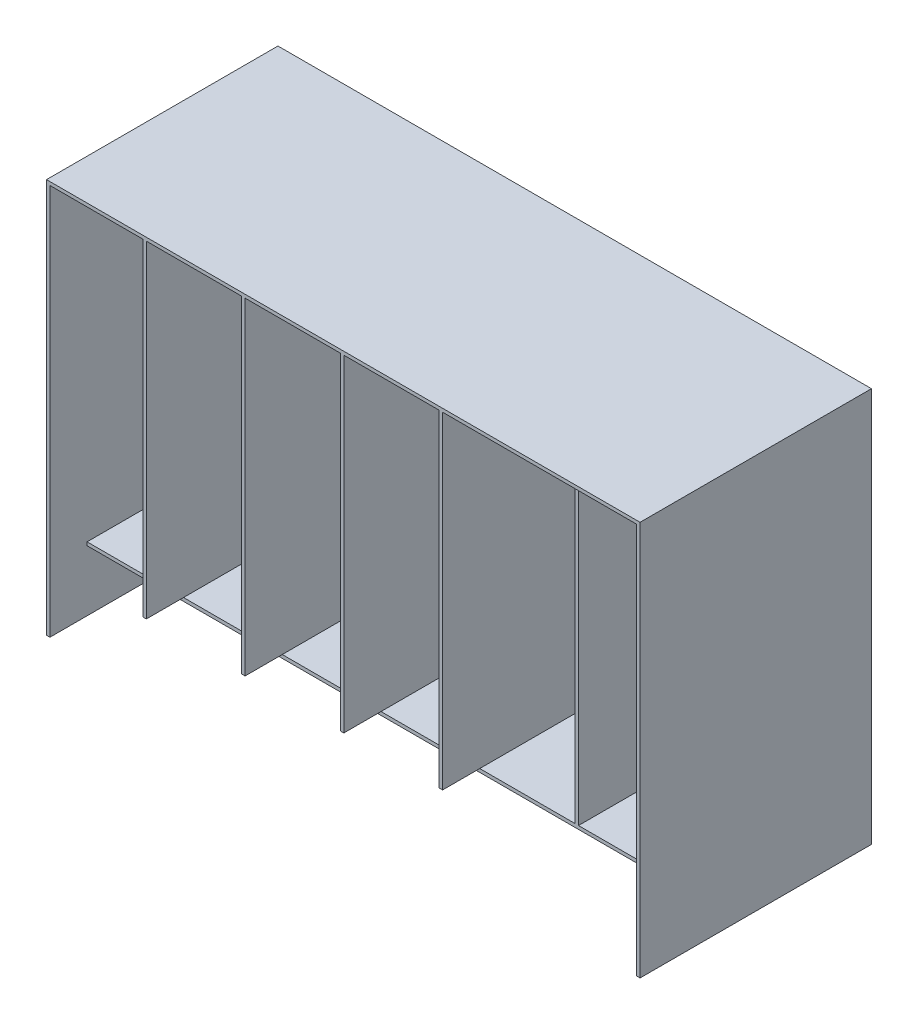
ISO-10303-21;
HEADER;
FILE_DESCRIPTION(('STEP AP214'),'2;1');
FILE_NAME('part.step','',(''),(''),'','','');
FILE_SCHEMA(('AUTOMOTIVE_DESIGN { 1 0 10303 214 1 1 1 1 }'));
ENDSEC;
DATA;
#1=APPLICATION_CONTEXT('core data for automotive mechanical design processes');
#2=APPLICATION_PROTOCOL_DEFINITION('international standard','automotive_design',2000,#1);
#3=PRODUCT_CONTEXT('',#1,'mechanical');
#4=PRODUCT('Part','Part','',(#3));
#5=PRODUCT_RELATED_PRODUCT_CATEGORY('part','',(#4));
#6=PRODUCT_DEFINITION_FORMATION('','',#4);
#7=PRODUCT_DEFINITION_CONTEXT('part definition',#1,'design');
#8=PRODUCT_DEFINITION('design','',#6,#7);
#9=PRODUCT_DEFINITION_SHAPE('','',#8);
#10=(LENGTH_UNIT() NAMED_UNIT(*) SI_UNIT(.MILLI.,.METRE.));
#11=(NAMED_UNIT(*) PLANE_ANGLE_UNIT() SI_UNIT($,.RADIAN.));
#12=(NAMED_UNIT(*) SI_UNIT($,.STERADIAN.) SOLID_ANGLE_UNIT());
#13=UNCERTAINTY_MEASURE_WITH_UNIT(LENGTH_MEASURE(1.E-05),#10,'distance_accuracy_value','');
#14=(GEOMETRIC_REPRESENTATION_CONTEXT(3) GLOBAL_UNCERTAINTY_ASSIGNED_CONTEXT((#13)) GLOBAL_UNIT_ASSIGNED_CONTEXT((#10,
#11,#12)) REPRESENTATION_CONTEXT('',''));
#15=CARTESIAN_POINT('',(0.,0.,0.));
#16=DIRECTION('',(0.,0.,1.));
#17=DIRECTION('',(1.,0.,0.));
#18=AXIS2_PLACEMENT_3D('',#15,#16,#17);
#19=CARTESIAN_POINT('',(0.,-157.216,179.775));
#20=DIRECTION('',(0.,1.,0.));
#21=DIRECTION('',(0.,0.,1.));
#22=AXIS2_PLACEMENT_3D('',#19,#20,#21);
#23=PLANE('',#22);
#24=DIRECTION('',(1.,0.,0.));
#25=VECTOR('',#24,1.);
#26=CARTESIAN_POINT('',(0.,-157.216,182.875));
#27=LINE('',#26,#25);
#28=CARTESIAN_POINT('',(-276.2265,-157.216,182.875));
#29=VERTEX_POINT('',#28);
#30=CARTESIAN_POINT('',(276.2265,-157.216,182.875));
#31=VERTEX_POINT('',#30);
#32=EDGE_CURVE('E280',#29,#31,#27,.T.);
#33=ORIENTED_EDGE('',*,*,#32,.F.);
#34=DIRECTION('',(0.,0.,-1.));
#35=VECTOR('',#34,1.);
#36=CARTESIAN_POINT('',(-276.2265,-157.216,179.775));
#37=LINE('',#36,#35);
#38=CARTESIAN_POINT('',(-276.2265,-157.216,3.175));
#39=VERTEX_POINT('',#38);
#40=EDGE_CURVE('E303',#29,#39,#37,.T.);
#41=ORIENTED_EDGE('',*,*,#40,.T.);
#42=DIRECTION('',(1.,0.,0.));
#43=VECTOR('',#42,1.);
#44=CARTESIAN_POINT('',(0.,-157.216,3.175));
#45=LINE('',#44,#43);
#46=CARTESIAN_POINT('',(276.2265,-157.216,3.175));
#47=VERTEX_POINT('',#46);
#48=EDGE_CURVE('E470',#39,#47,#45,.T.);
#49=ORIENTED_EDGE('',*,*,#48,.T.);
#50=DIRECTION('',(0.,0.,-1.));
#51=VECTOR('',#50,1.);
#52=CARTESIAN_POINT('',(276.2265,-157.216,179.775));
#53=LINE('',#52,#51);
#54=EDGE_CURVE('E309',#31,#47,#53,.T.);
#55=ORIENTED_EDGE('',*,*,#54,.F.);
#56=EDGE_LOOP('',(#33,#41,#49,#55));
#57=FACE_BOUND('',#56,.T.);
#58=ADVANCED_FACE('F41',(#57),#23,.F.);
#59=CARTESIAN_POINT('',(0.,0.,217.875));
#60=DIRECTION('',(0.,0.,1.));
#61=DIRECTION('',(1.,0.,0.));
#62=AXIS2_PLACEMENT_3D('',#59,#60,#61);
#63=PLANE('',#62);
#64=DIRECTION('',(0.,-1.,0.));
#65=VECTOR('',#64,1.);
#66=CARTESIAN_POINT('',(276.2265,0.,217.875));
#67=LINE('',#66,#65);
#68=CARTESIAN_POINT('',(276.2265,154.041,217.875));
#69=VERTEX_POINT('',#68);
#70=CARTESIAN_POINT('',(276.2265,-214.366,217.875));
#71=VERTEX_POINT('',#70);
#72=EDGE_CURVE('E554',#69,#71,#67,.T.);
#73=ORIENTED_EDGE('',*,*,#72,.T.);
#74=DIRECTION('',(1.,0.,0.));
#75=VECTOR('',#74,1.);
#76=CARTESIAN_POINT('',(0.,-214.366,217.875));
#77=LINE('',#76,#75);
#78=CARTESIAN_POINT('',(279.4015,-214.366,217.875));
#79=VERTEX_POINT('',#78);
#80=EDGE_CURVE('E408',#71,#79,#77,.T.);
#81=ORIENTED_EDGE('',*,*,#80,.T.);
#82=DIRECTION('',(0.,1.,0.));
#83=VECTOR('',#82,1.);
#84=CARTESIAN_POINT('',(279.4015,0.,217.875));
#85=LINE('',#84,#83);
#86=CARTESIAN_POINT('',(279.4015,157.216,217.875));
#87=VERTEX_POINT('',#86);
#88=EDGE_CURVE('E388',#79,#87,#85,.T.);
#89=ORIENTED_EDGE('',*,*,#88,.T.);
#90=DIRECTION('',(-1.,0.,0.));
#91=VECTOR('',#90,1.);
#92=CARTESIAN_POINT('',(0.,157.216,217.875));
#93=LINE('',#92,#91);
#94=CARTESIAN_POINT('',(-279.4015,157.216,217.875));
#95=VERTEX_POINT('',#94);
#96=EDGE_CURVE('E403',#87,#95,#93,.T.);
#97=ORIENTED_EDGE('',*,*,#96,.T.);
#98=DIRECTION('',(0.,-1.,0.));
#99=VECTOR('',#98,1.);
#100=CARTESIAN_POINT('',(-279.4015,0.,217.875));
#101=LINE('',#100,#99);
#102=CARTESIAN_POINT('',(-279.4015,-214.366,217.875));
#103=VERTEX_POINT('',#102);
#104=EDGE_CURVE('E557',#95,#103,#101,.T.);
#105=ORIENTED_EDGE('',*,*,#104,.T.);
#106=DIRECTION('',(1.,0.,0.));
#107=VECTOR('',#106,1.);
#108=CARTESIAN_POINT('',(0.,-214.366,217.875));
#109=LINE('',#108,#107);
#110=CARTESIAN_POINT('',(-276.2265,-214.366,217.875));
#111=VERTEX_POINT('',#110);
#112=EDGE_CURVE('E412',#103,#111,#109,.T.);
#113=ORIENTED_EDGE('',*,*,#112,.T.);
#114=DIRECTION('',(0.,1.,0.));
#115=VECTOR('',#114,1.);
#116=CARTESIAN_POINT('',(-276.2265,0.,217.875));
#117=LINE('',#116,#115);
#118=CARTESIAN_POINT('',(-276.2265,154.041,217.875));
#119=VERTEX_POINT('',#118);
#120=EDGE_CURVE('E556',#111,#119,#117,.T.);
#121=ORIENTED_EDGE('',*,*,#120,.T.);
#122=DIRECTION('',(1.,0.,0.));
#123=VECTOR('',#122,1.);
#124=CARTESIAN_POINT('',(0.,154.041,217.875));
#125=LINE('',#124,#123);
#126=CARTESIAN_POINT('',(-188.5945,154.041,217.875));
#127=VERTEX_POINT('',#126);
#128=EDGE_CURVE('E534',#119,#127,#125,.T.);
#129=ORIENTED_EDGE('',*,*,#128,.T.);
#130=DIRECTION('',(0.,-1.,0.));
#131=VECTOR('',#130,1.);
#132=CARTESIAN_POINT('',(-188.5945,0.,217.875));
#133=LINE('',#132,#131);
#134=CARTESIAN_POINT('',(-188.5945,-154.041,217.875));
#135=VERTEX_POINT('',#134);
#136=EDGE_CURVE('E529',#127,#135,#133,.T.);
#137=ORIENTED_EDGE('',*,*,#136,.T.);
#138=DIRECTION('',(-1.,0.,0.));
#139=VECTOR('',#138,1.);
#140=CARTESIAN_POINT('',(0.,-154.041,217.875));
#141=LINE('',#140,#139);
#142=CARTESIAN_POINT('',(-185.4195,-154.041,217.875));
#143=VERTEX_POINT('',#142);
#144=EDGE_CURVE('E587',#143,#135,#141,.T.);
#145=ORIENTED_EDGE('',*,*,#144,.F.);
#146=DIRECTION('',(0.,1.,0.));
#147=VECTOR('',#146,1.);
#148=CARTESIAN_POINT('',(-185.4195,0.,217.875));
#149=LINE('',#148,#147);
#150=CARTESIAN_POINT('',(-185.4195,154.041,217.875));
#151=VERTEX_POINT('',#150);
#152=EDGE_CURVE('E546',#143,#151,#149,.T.);
#153=ORIENTED_EDGE('',*,*,#152,.T.);
#154=CARTESIAN_POINT('',(-95.6305,154.041,217.875));
#155=VERTEX_POINT('',#154);
#156=EDGE_CURVE('E582',#151,#155,#125,.T.);
#157=ORIENTED_EDGE('',*,*,#156,.T.);
#158=DIRECTION('',(0.,-1.,0.));
#159=VECTOR('',#158,1.);
#160=CARTESIAN_POINT('',(-95.6305,0.,217.875));
#161=LINE('',#160,#159);
#162=CARTESIAN_POINT('',(-95.6305,-154.041,217.875));
#163=VERTEX_POINT('',#162);
#164=EDGE_CURVE('E579',#155,#163,#161,.T.);
#165=ORIENTED_EDGE('',*,*,#164,.T.);
#166=CARTESIAN_POINT('',(-92.4555,-154.041,217.875));
#167=VERTEX_POINT('',#166);
#168=EDGE_CURVE('E588',#167,#163,#141,.T.);
#169=ORIENTED_EDGE('',*,*,#168,.F.);
#170=DIRECTION('',(0.,1.,0.));
#171=VECTOR('',#170,1.);
#172=CARTESIAN_POINT('',(-92.4555,0.,217.875));
#173=LINE('',#172,#171);
#174=CARTESIAN_POINT('',(-92.4555,154.041,217.875));
#175=VERTEX_POINT('',#174);
#176=EDGE_CURVE('E576',#167,#175,#173,.T.);
#177=ORIENTED_EDGE('',*,*,#176,.T.);
#178=CARTESIAN_POINT('',(-2.66650000000004,154.041,217.875));
#179=VERTEX_POINT('',#178);
#180=EDGE_CURVE('E575',#175,#179,#125,.T.);
#181=ORIENTED_EDGE('',*,*,#180,.T.);
#182=DIRECTION('',(0.,-1.,0.));
#183=VECTOR('',#182,1.);
#184=CARTESIAN_POINT('',(-2.66650000000004,0.,217.875));
#185=LINE('',#184,#183);
#186=CARTESIAN_POINT('',(-2.66650000000004,-154.041,217.875));
#187=VERTEX_POINT('',#186);
#188=EDGE_CURVE('E572',#179,#187,#185,.T.);
#189=ORIENTED_EDGE('',*,*,#188,.T.);
#190=CARTESIAN_POINT('',(0.508499999999967,-154.041,217.875));
#191=VERTEX_POINT('',#190);
#192=EDGE_CURVE('E711',#191,#187,#141,.T.);
#193=ORIENTED_EDGE('',*,*,#192,.F.);
#194=DIRECTION('',(0.,1.,0.));
#195=VECTOR('',#194,1.);
#196=CARTESIAN_POINT('',(0.508499999999967,0.,217.875));
#197=LINE('',#196,#195);
#198=CARTESIAN_POINT('',(0.508499999999967,154.041,217.875));
#199=VERTEX_POINT('',#198);
#200=EDGE_CURVE('E570',#191,#199,#197,.T.);
#201=ORIENTED_EDGE('',*,*,#200,.T.);
#202=CARTESIAN_POINT('',(90.2974999999999,154.041,217.875));
#203=VERTEX_POINT('',#202);
#204=EDGE_CURVE('E501',#199,#203,#125,.T.);
#205=ORIENTED_EDGE('',*,*,#204,.T.);
#206=DIRECTION('',(0.,-1.,0.));
#207=VECTOR('',#206,1.);
#208=CARTESIAN_POINT('',(90.2974999999999,0.,217.875));
#209=LINE('',#208,#207);
#210=CARTESIAN_POINT('',(90.2974999999999,-154.041,217.875));
#211=VERTEX_POINT('',#210);
#212=EDGE_CURVE('E567',#203,#211,#209,.T.);
#213=ORIENTED_EDGE('',*,*,#212,.T.);
#214=CARTESIAN_POINT('',(93.4725,-154.041,217.875));
#215=VERTEX_POINT('',#214);
#216=EDGE_CURVE('E284',#215,#211,#141,.T.);
#217=ORIENTED_EDGE('',*,*,#216,.F.);
#218=DIRECTION('',(0.,1.,0.));
#219=VECTOR('',#218,1.);
#220=CARTESIAN_POINT('',(93.4725,0.,217.875));
#221=LINE('',#220,#219);
#222=CARTESIAN_POINT('',(93.4725,154.041,217.875));
#223=VERTEX_POINT('',#222);
#224=EDGE_CURVE('E564',#215,#223,#221,.T.);
#225=ORIENTED_EDGE('',*,*,#224,.T.);
#226=EDGE_CURVE('E563',#223,#69,#125,.T.);
#227=ORIENTED_EDGE('',*,*,#226,.T.);
#228=EDGE_LOOP('',(#73,#81,#89,#97,#105,#113,#121,#129,#137,#145,#153,#157,#165,#169,#177,#181,
#189,#193,#201,#205,#213,#217,#225,#227));
#229=FACE_BOUND('',#228,.T.);
#230=ADVANCED_FACE('F405',(#229),#63,.T.);
#231=CARTESIAN_POINT('',(0.,-154.041,179.775));
#232=DIRECTION('',(0.,1.,0.));
#233=DIRECTION('',(-1.,0.,0.));
#234=AXIS2_PLACEMENT_3D('',#231,#232,#233);
#235=PLANE('',#234);
#236=DIRECTION('',(0.,0.,-1.));
#237=VECTOR('',#236,1.);
#238=CARTESIAN_POINT('',(-185.4195,-154.041,179.775));
#239=LINE('',#238,#237);
#240=CARTESIAN_POINT('',(-185.4195,-154.041,182.875));
#241=VERTEX_POINT('',#240);
#242=CARTESIAN_POINT('',(-185.4195,-154.041,3.175));
#243=VERTEX_POINT('',#242);
#244=EDGE_CURVE('E326',#241,#243,#239,.T.);
#245=ORIENTED_EDGE('',*,*,#244,.F.);
#246=DIRECTION('',(-1.,0.,0.));
#247=VECTOR('',#246,1.);
#248=CARTESIAN_POINT('',(0.,-154.041,182.875));
#249=LINE('',#248,#247);
#250=CARTESIAN_POINT('',(-95.6305,-154.041,182.875));
#251=VERTEX_POINT('',#250);
#252=EDGE_CURVE('E687',#251,#241,#249,.T.);
#253=ORIENTED_EDGE('',*,*,#252,.F.);
#254=DIRECTION('',(0.,0.,-1.));
#255=VECTOR('',#254,1.);
#256=CARTESIAN_POINT('',(-95.6305,-154.041,179.775));
#257=LINE('',#256,#255);
#258=CARTESIAN_POINT('',(-95.6305,-154.041,3.175));
#259=VERTEX_POINT('',#258);
#260=EDGE_CURVE('E331',#251,#259,#257,.T.);
#261=ORIENTED_EDGE('',*,*,#260,.T.);
#262=DIRECTION('',(1.,0.,0.));
#263=VECTOR('',#262,1.);
#264=CARTESIAN_POINT('',(0.,-154.041,3.175));
#265=LINE('',#264,#263);
#266=EDGE_CURVE('E457',#243,#259,#265,.T.);
#267=ORIENTED_EDGE('',*,*,#266,.F.);
#268=EDGE_LOOP('',(#245,#253,#261,#267));
#269=FACE_BOUND('',#268,.T.);
#270=ADVANCED_FACE('F623',(#269),#235,.T.);
#271=DIRECTION('',(0.,0.,-1.));
#272=VECTOR('',#271,1.);
#273=CARTESIAN_POINT('',(-92.4555,-154.041,179.775));
#274=LINE('',#273,#272);
#275=CARTESIAN_POINT('',(-92.4555,-154.041,182.875));
#276=VERTEX_POINT('',#275);
#277=CARTESIAN_POINT('',(-92.4555,-154.041,3.175));
#278=VERTEX_POINT('',#277);
#279=EDGE_CURVE('E337',#276,#278,#274,.T.);
#280=ORIENTED_EDGE('',*,*,#279,.F.);
#281=CARTESIAN_POINT('',(-2.66650000000004,-154.041,182.875));
#282=VERTEX_POINT('',#281);
#283=EDGE_CURVE('E681',#282,#276,#249,.T.);
#284=ORIENTED_EDGE('',*,*,#283,.F.);
#285=DIRECTION('',(0.,0.,-1.));
#286=VECTOR('',#285,1.);
#287=CARTESIAN_POINT('',(-2.66650000000004,-154.041,179.775));
#288=LINE('',#287,#286);
#289=CARTESIAN_POINT('',(-2.66650000000004,-154.041,3.175));
#290=VERTEX_POINT('',#289);
#291=EDGE_CURVE('E342',#282,#290,#288,.T.);
#292=ORIENTED_EDGE('',*,*,#291,.T.);
#293=EDGE_CURVE('E449',#278,#290,#265,.T.);
#294=ORIENTED_EDGE('',*,*,#293,.F.);
#295=EDGE_LOOP('',(#280,#284,#292,#294));
#296=FACE_BOUND('',#295,.T.);
#297=ADVANCED_FACE('F666',(#296),#235,.T.);
#298=DIRECTION('',(0.,0.,-1.));
#299=VECTOR('',#298,1.);
#300=CARTESIAN_POINT('',(0.508499999999967,-154.041,179.775));
#301=LINE('',#300,#299);
#302=CARTESIAN_POINT('',(0.508499999999967,-154.041,182.875));
#303=VERTEX_POINT('',#302);
#304=CARTESIAN_POINT('',(0.508499999999967,-154.041,3.175));
#305=VERTEX_POINT('',#304);
#306=EDGE_CURVE('E348',#303,#305,#301,.T.);
#307=ORIENTED_EDGE('',*,*,#306,.F.);
#308=CARTESIAN_POINT('',(90.2974999999999,-154.041,182.875));
#309=VERTEX_POINT('',#308);
#310=EDGE_CURVE('E677',#309,#303,#249,.T.);
#311=ORIENTED_EDGE('',*,*,#310,.F.);
#312=DIRECTION('',(0.,0.,-1.));
#313=VECTOR('',#312,1.);
#314=CARTESIAN_POINT('',(90.2974999999999,-154.041,179.775));
#315=LINE('',#314,#313);
#316=CARTESIAN_POINT('',(90.2974999999999,-154.041,3.175));
#317=VERTEX_POINT('',#316);
#318=EDGE_CURVE('E353',#309,#317,#315,.T.);
#319=ORIENTED_EDGE('',*,*,#318,.T.);
#320=EDGE_CURVE('E436',#305,#317,#265,.T.);
#321=ORIENTED_EDGE('',*,*,#320,.F.);
#322=EDGE_LOOP('',(#307,#311,#319,#321));
#323=FACE_BOUND('',#322,.T.);
#324=ADVANCED_FACE('F510',(#323),#235,.T.);
#325=CARTESIAN_POINT('',(183.2615,0.,179.775));
#326=DIRECTION('',(-1.,0.,0.));
#327=DIRECTION('',(0.,0.,1.));
#328=AXIS2_PLACEMENT_3D('',#325,#326,#327);
#329=PLANE('',#328);
#330=DIRECTION('',(0.,0.,-1.));
#331=VECTOR('',#330,1.);
#332=CARTESIAN_POINT('',(183.2615,-154.041,179.775));
#333=LINE('',#332,#331);
#334=CARTESIAN_POINT('',(183.2615,-154.041,182.875));
#335=VERTEX_POINT('',#334);
#336=CARTESIAN_POINT('',(183.2615,-154.041,3.175));
#337=VERTEX_POINT('',#336);
#338=EDGE_CURVE('E364',#335,#337,#333,.T.);
#339=ORIENTED_EDGE('',*,*,#338,.F.);
#340=DIRECTION('',(0.,-1.,0.));
#341=VECTOR('',#340,1.);
#342=CARTESIAN_POINT('',(183.2615,0.,182.875));
#343=LINE('',#342,#341);
#344=CARTESIAN_POINT('',(183.2615,154.041,182.875));
#345=VERTEX_POINT('',#344);
#346=EDGE_CURVE('E590',#345,#335,#343,.T.);
#347=ORIENTED_EDGE('',*,*,#346,.F.);
#348=DIRECTION('',(0.,0.,-1.));
#349=VECTOR('',#348,1.);
#350=CARTESIAN_POINT('',(183.2615,154.041,179.775));
#351=LINE('',#350,#349);
#352=CARTESIAN_POINT('',(183.2615,154.041,3.175));
#353=VERTEX_POINT('',#352);
#354=EDGE_CURVE('E349',#345,#353,#351,.T.);
#355=ORIENTED_EDGE('',*,*,#354,.T.);
#356=DIRECTION('',(0.,1.,0.));
#357=VECTOR('',#356,1.);
#358=CARTESIAN_POINT('',(183.2615,0.,3.175));
#359=LINE('',#358,#357);
#360=EDGE_CURVE('E427',#337,#353,#359,.T.);
#361=ORIENTED_EDGE('',*,*,#360,.F.);
#362=EDGE_LOOP('',(#339,#347,#355,#361));
#363=FACE_BOUND('',#362,.T.);
#364=ADVANCED_FACE('F656',(#363),#329,.T.);
#365=DIRECTION('',(0.,0.,-1.));
#366=VECTOR('',#365,1.);
#367=CARTESIAN_POINT('',(93.4725,-154.041,179.775));
#368=LINE('',#367,#366);
#369=CARTESIAN_POINT('',(93.4725,-154.041,182.875));
#370=VERTEX_POINT('',#369);
#371=CARTESIAN_POINT('',(93.4725,-154.041,3.175));
#372=VERTEX_POINT('',#371);
#373=EDGE_CURVE('E359',#370,#372,#368,.T.);
#374=ORIENTED_EDGE('',*,*,#373,.F.);
#375=EDGE_CURVE('E295',#335,#370,#249,.T.);
#376=ORIENTED_EDGE('',*,*,#375,.F.);
#377=ORIENTED_EDGE('',*,*,#338,.T.);
#378=EDGE_CURVE('E432',#372,#337,#265,.T.);
#379=ORIENTED_EDGE('',*,*,#378,.F.);
#380=EDGE_LOOP('',(#374,#376,#377,#379));
#381=FACE_BOUND('',#380,.T.);
#382=ADVANCED_FACE('F658',(#381),#235,.T.);
#383=CARTESIAN_POINT('',(186.4365,0.,179.775));
#384=DIRECTION('',(-1.,0.,0.));
#385=DIRECTION('',(0.,0.,1.));
#386=AXIS2_PLACEMENT_3D('',#383,#384,#385);
#387=PLANE('',#386);
#388=DIRECTION('',(0.,1.,0.));
#389=VECTOR('',#388,1.);
#390=CARTESIAN_POINT('',(186.4365,0.,182.875));
#391=LINE('',#390,#389);
#392=CARTESIAN_POINT('',(186.4365,-154.041,182.875));
#393=VERTEX_POINT('',#392);
#394=CARTESIAN_POINT('',(186.4365,154.041,182.875));
#395=VERTEX_POINT('',#394);
#396=EDGE_CURVE('E293',#393,#395,#391,.T.);
#397=ORIENTED_EDGE('',*,*,#396,.F.);
#398=DIRECTION('',(0.,0.,-1.));
#399=VECTOR('',#398,1.);
#400=CARTESIAN_POINT('',(186.4365,-154.041,179.775));
#401=LINE('',#400,#399);
#402=CARTESIAN_POINT('',(186.4365,-154.041,3.175));
#403=VERTEX_POINT('',#402);
#404=EDGE_CURVE('E292',#393,#403,#401,.T.);
#405=ORIENTED_EDGE('',*,*,#404,.T.);
#406=DIRECTION('',(0.,1.,0.));
#407=VECTOR('',#406,1.);
#408=CARTESIAN_POINT('',(186.4365,0.,3.175));
#409=LINE('',#408,#407);
#410=CARTESIAN_POINT('',(186.4365,154.041,3.175));
#411=VERTEX_POINT('',#410);
#412=EDGE_CURVE('E475',#403,#411,#409,.T.);
#413=ORIENTED_EDGE('',*,*,#412,.T.);
#414=DIRECTION('',(0.,0.,-1.));
#415=VECTOR('',#414,1.);
#416=CARTESIAN_POINT('',(186.4365,154.041,179.775));
#417=LINE('',#416,#415);
#418=EDGE_CURVE('E64',#395,#411,#417,.T.);
#419=ORIENTED_EDGE('',*,*,#418,.F.);
#420=EDGE_LOOP('',(#397,#405,#413,#419));
#421=FACE_BOUND('',#420,.T.);
#422=ADVANCED_FACE('F596',(#421),#387,.F.);
#423=ORIENTED_EDGE('',*,*,#404,.F.);
#424=CARTESIAN_POINT('',(276.2265,-154.041,182.875));
#425=VERTEX_POINT('',#424);
#426=EDGE_CURVE('E277',#425,#393,#249,.T.);
#427=ORIENTED_EDGE('',*,*,#426,.F.);
#428=DIRECTION('',(0.,0.,-1.));
#429=VECTOR('',#428,1.);
#430=CARTESIAN_POINT('',(276.2265,-154.041,179.775));
#431=LINE('',#430,#429);
#432=CARTESIAN_POINT('',(276.2265,-154.041,3.175));
#433=VERTEX_POINT('',#432);
#434=EDGE_CURVE('E290',#425,#433,#431,.T.);
#435=ORIENTED_EDGE('',*,*,#434,.T.);
#436=EDGE_CURVE('E360',#403,#433,#265,.T.);
#437=ORIENTED_EDGE('',*,*,#436,.F.);
#438=EDGE_LOOP('',(#423,#427,#435,#437));
#439=FACE_BOUND('',#438,.T.);
#440=ADVANCED_FACE('F288',(#439),#235,.T.);
#441=DIRECTION('',(0.,0.,-1.));
#442=VECTOR('',#441,1.);
#443=CARTESIAN_POINT('',(-276.2265,-154.041,179.775));
#444=LINE('',#443,#442);
#445=CARTESIAN_POINT('',(-276.2265,-154.041,182.875));
#446=VERTEX_POINT('',#445);
#447=CARTESIAN_POINT('',(-276.2265,-154.041,3.175));
#448=VERTEX_POINT('',#447);
#449=EDGE_CURVE('E316',#446,#448,#444,.T.);
#450=ORIENTED_EDGE('',*,*,#449,.F.);
#451=DIRECTION('',(1.,0.,0.));
#452=VECTOR('',#451,1.);
#453=CARTESIAN_POINT('',(0.,-154.041,182.875));
#454=LINE('',#453,#452);
#455=CARTESIAN_POINT('',(-188.5945,-154.041,182.875));
#456=VERTEX_POINT('',#455);
#457=EDGE_CURVE('E11',#446,#456,#454,.T.);
#458=ORIENTED_EDGE('',*,*,#457,.T.);
#459=DIRECTION('',(0.,0.,-1.));
#460=VECTOR('',#459,1.);
#461=CARTESIAN_POINT('',(-188.5945,-154.041,179.775));
#462=LINE('',#461,#460);
#463=CARTESIAN_POINT('',(-188.5945,-154.041,3.175));
#464=VERTEX_POINT('',#463);
#465=EDGE_CURVE('E319',#456,#464,#462,.T.);
#466=ORIENTED_EDGE('',*,*,#465,.T.);
#467=EDGE_CURVE('E464',#448,#464,#265,.T.);
#468=ORIENTED_EDGE('',*,*,#467,.F.);
#469=EDGE_LOOP('',(#450,#458,#466,#468));
#470=FACE_BOUND('',#469,.T.);
#471=ADVANCED_FACE('F542',(#470),#235,.T.);
#472=CARTESIAN_POINT('',(0.,157.216,3.175));
#473=DIRECTION('',(0.,1.,0.));
#474=DIRECTION('',(0.,0.,1.));
#475=AXIS2_PLACEMENT_3D('',#472,#473,#474);
#476=PLANE('',#475);
#477=DIRECTION('',(1.,0.,0.));
#478=VECTOR('',#477,1.);
#479=CARTESIAN_POINT('',(0.,157.216,0.));
#480=LINE('',#479,#478);
#481=CARTESIAN_POINT('',(-279.4015,157.216,0.));
#482=VERTEX_POINT('',#481);
#483=CARTESIAN_POINT('',(279.4015,157.216,0.));
#484=VERTEX_POINT('',#483);
#485=EDGE_CURVE('E367',#482,#484,#480,.T.);
#486=ORIENTED_EDGE('',*,*,#485,.F.);
#487=DIRECTION('',(0.,0.,-1.));
#488=VECTOR('',#487,1.);
#489=CARTESIAN_POINT('',(-279.4015,157.216,3.175));
#490=LINE('',#489,#488);
#491=EDGE_CURVE('E49',#95,#482,#490,.T.);
#492=ORIENTED_EDGE('',*,*,#491,.F.);
#493=ORIENTED_EDGE('',*,*,#96,.F.);
#494=DIRECTION('',(0.,0.,-1.));
#495=VECTOR('',#494,1.);
#496=CARTESIAN_POINT('',(279.4015,157.216,3.175));
#497=LINE('',#496,#495);
#498=EDGE_CURVE('E375',#87,#484,#497,.T.);
#499=ORIENTED_EDGE('',*,*,#498,.T.);
#500=EDGE_LOOP('',(#486,#492,#493,#499));
#501=FACE_BOUND('',#500,.T.);
#502=ADVANCED_FACE('F400',(#501),#476,.T.);
#503=CARTESIAN_POINT('',(-279.4015,0.,3.175));
#504=DIRECTION('',(1.,0.,0.));
#505=DIRECTION('',(0.,1.,0.));
#506=AXIS2_PLACEMENT_3D('',#503,#504,#505);
#507=PLANE('',#506);
#508=DIRECTION('',(0.,-1.,0.));
#509=VECTOR('',#508,1.);
#510=CARTESIAN_POINT('',(-279.4015,0.,0.));
#511=LINE('',#510,#509);
#512=CARTESIAN_POINT('',(-279.4015,-214.366,0.));
#513=VERTEX_POINT('',#512);
#514=EDGE_CURVE('E370',#482,#513,#511,.T.);
#515=ORIENTED_EDGE('',*,*,#514,.T.);
#516=DIRECTION('',(0.,0.,-1.));
#517=VECTOR('',#516,1.);
#518=CARTESIAN_POINT('',(-279.4015,-214.366,3.175));
#519=LINE('',#518,#517);
#520=EDGE_CURVE('E380',#103,#513,#519,.T.);
#521=ORIENTED_EDGE('',*,*,#520,.F.);
#522=ORIENTED_EDGE('',*,*,#104,.F.);
#523=ORIENTED_EDGE('',*,*,#491,.T.);
#524=EDGE_LOOP('',(#515,#521,#522,#523));
#525=FACE_BOUND('',#524,.T.);
#526=ADVANCED_FACE('F1444',(#525),#507,.F.);
#527=CARTESIAN_POINT('',(279.4015,0.,3.175));
#528=DIRECTION('',(1.,0.,0.));
#529=DIRECTION('',(0.,0.,-1.));
#530=AXIS2_PLACEMENT_3D('',#527,#528,#529);
#531=PLANE('',#530);
#532=DIRECTION('',(0.,-1.,0.));
#533=VECTOR('',#532,1.);
#534=CARTESIAN_POINT('',(279.4015,0.,0.));
#535=LINE('',#534,#533);
#536=CARTESIAN_POINT('',(279.4015,-214.366,0.));
#537=VERTEX_POINT('',#536);
#538=EDGE_CURVE('E373',#484,#537,#535,.T.);
#539=ORIENTED_EDGE('',*,*,#538,.F.);
#540=ORIENTED_EDGE('',*,*,#498,.F.);
#541=ORIENTED_EDGE('',*,*,#88,.F.);
#542=DIRECTION('',(0.,0.,-1.));
#543=VECTOR('',#542,1.);
#544=CARTESIAN_POINT('',(279.4015,-214.366,3.175));
#545=LINE('',#544,#543);
#546=EDGE_CURVE('E371',#79,#537,#545,.T.);
#547=ORIENTED_EDGE('',*,*,#546,.T.);
#548=EDGE_LOOP('',(#539,#540,#541,#547));
#549=FACE_BOUND('',#548,.T.);
#550=ADVANCED_FACE('F386',(#549),#531,.T.);
#551=CARTESIAN_POINT('',(0.,0.,0.));
#552=DIRECTION('',(0.,0.,1.));
#553=DIRECTION('',(1.,0.,0.));
#554=AXIS2_PLACEMENT_3D('',#551,#552,#553);
#555=PLANE('',#554);
#556=ORIENTED_EDGE('',*,*,#485,.T.);
#557=ORIENTED_EDGE('',*,*,#538,.T.);
#558=DIRECTION('',(1.,0.,0.));
#559=VECTOR('',#558,1.);
#560=CARTESIAN_POINT('',(-279.4015,-214.366,0.));
#561=LINE('',#560,#559);
#562=EDGE_CURVE('E308',#513,#537,#561,.T.);
#563=ORIENTED_EDGE('',*,*,#562,.F.);
#564=ORIENTED_EDGE('',*,*,#514,.F.);
#565=EDGE_LOOP('',(#556,#557,#563,#564));
#566=FACE_BOUND('',#565,.T.);
#567=ADVANCED_FACE('F397',(#566),#555,.F.);
#568=CARTESIAN_POINT('',(-279.4015,-214.366,3.175));
#569=DIRECTION('',(0.,1.,0.));
#570=DIRECTION('',(0.,0.,1.));
#571=AXIS2_PLACEMENT_3D('',#568,#569,#570);
#572=PLANE('',#571);
#573=DIRECTION('',(1.,0.,0.));
#574=VECTOR('',#573,1.);
#575=CARTESIAN_POINT('',(0.,-214.366,3.175));
#576=LINE('',#575,#574);
#577=CARTESIAN_POINT('',(-276.2265,-214.366,3.175));
#578=VERTEX_POINT('',#577);
#579=CARTESIAN_POINT('',(276.2265,-214.366,3.175));
#580=VERTEX_POINT('',#579);
#581=EDGE_CURVE('E410',#578,#580,#576,.T.);
#582=ORIENTED_EDGE('',*,*,#581,.F.);
#583=DIRECTION('',(0.,0.,-1.));
#584=VECTOR('',#583,1.);
#585=CARTESIAN_POINT('',(-276.2265,-214.366,0.));
#586=LINE('',#585,#584);
#587=EDGE_CURVE('E421',#111,#578,#586,.T.);
#588=ORIENTED_EDGE('',*,*,#587,.F.);
#589=ORIENTED_EDGE('',*,*,#112,.F.);
#590=ORIENTED_EDGE('',*,*,#520,.T.);
#591=ORIENTED_EDGE('',*,*,#562,.T.);
#592=ORIENTED_EDGE('',*,*,#546,.F.);
#593=ORIENTED_EDGE('',*,*,#80,.F.);
#594=DIRECTION('',(0.,0.,1.));
#595=VECTOR('',#594,1.);
#596=CARTESIAN_POINT('',(276.2265,-214.366,0.));
#597=LINE('',#596,#595);
#598=EDGE_CURVE('E418',#580,#71,#597,.T.);
#599=ORIENTED_EDGE('',*,*,#598,.F.);
#600=EDGE_LOOP('',(#582,#588,#589,#590,#591,#592,#593,#599));
#601=FACE_BOUND('',#600,.T.);
#602=ADVANCED_FACE('F43',(#601),#572,.F.);
#603=CARTESIAN_POINT('',(-276.2265,2.84088022521186E-13,179.775));
#604=DIRECTION('',(1.,0.,0.));
#605=DIRECTION('',(0.,1.,0.));
#606=AXIS2_PLACEMENT_3D('',#603,#604,#605);
#607=PLANE('',#606);
#608=DIRECTION('',(0.,-1.,0.));
#609=VECTOR('',#608,1.);
#610=CARTESIAN_POINT('',(-276.2265,2.84088022521186E-13,3.175));
#611=LINE('',#610,#609);
#612=EDGE_CURVE('E468',#39,#578,#611,.T.);
#613=ORIENTED_EDGE('',*,*,#612,.F.);
#614=ORIENTED_EDGE('',*,*,#40,.F.);
#615=DIRECTION('',(0.,-1.,0.));
#616=VECTOR('',#615,1.);
#617=CARTESIAN_POINT('',(-276.2265,0.,182.875));
#618=LINE('',#617,#616);
#619=EDGE_CURVE('E541',#446,#29,#618,.T.);
#620=ORIENTED_EDGE('',*,*,#619,.F.);
#621=ORIENTED_EDGE('',*,*,#449,.T.);
#622=DIRECTION('',(0.,-1.,0.));
#623=VECTOR('',#622,1.);
#624=CARTESIAN_POINT('',(-276.2265,0.,3.175));
#625=LINE('',#624,#623);
#626=CARTESIAN_POINT('',(-276.2265,154.041,3.175));
#627=VERTEX_POINT('',#626);
#628=EDGE_CURVE('E465',#627,#448,#625,.T.);
#629=ORIENTED_EDGE('',*,*,#628,.F.);
#630=DIRECTION('',(0.,0.,-1.));
#631=VECTOR('',#630,1.);
#632=CARTESIAN_POINT('',(-276.2265,154.041,179.775));
#633=LINE('',#632,#631);
#634=EDGE_CURVE('E313',#119,#627,#633,.T.);
#635=ORIENTED_EDGE('',*,*,#634,.F.);
#636=ORIENTED_EDGE('',*,*,#120,.F.);
#637=ORIENTED_EDGE('',*,*,#587,.T.);
#638=EDGE_LOOP('',(#613,#614,#620,#621,#629,#635,#636,#637));
#639=FACE_BOUND('',#638,.T.);
#640=ADVANCED_FACE('F538',(#639),#607,.T.);
#641=CARTESIAN_POINT('',(0.,0.,3.175));
#642=DIRECTION('',(0.,0.,1.));
#643=DIRECTION('',(1.,0.,0.));
#644=AXIS2_PLACEMENT_3D('',#641,#642,#643);
#645=PLANE('',#644);
#646=ORIENTED_EDGE('',*,*,#612,.T.);
#647=ORIENTED_EDGE('',*,*,#581,.T.);
#648=DIRECTION('',(0.,-1.,0.));
#649=VECTOR('',#648,1.);
#650=CARTESIAN_POINT('',(276.2265,0.,3.175));
#651=LINE('',#650,#649);
#652=EDGE_CURVE('E473',#47,#580,#651,.T.);
#653=ORIENTED_EDGE('',*,*,#652,.F.);
#654=ORIENTED_EDGE('',*,*,#48,.F.);
#655=EDGE_LOOP('',(#646,#647,#653,#654));
#656=FACE_BOUND('',#655,.T.);
#657=ADVANCED_FACE('F550',(#656),#645,.T.);
#658=DIRECTION('',(-1.,0.,0.));
#659=VECTOR('',#658,1.);
#660=CARTESIAN_POINT('',(0.,154.041,3.175));
#661=LINE('',#660,#659);
#662=CARTESIAN_POINT('',(-95.6305,154.041,3.175));
#663=VERTEX_POINT('',#662);
#664=CARTESIAN_POINT('',(-185.4195,154.041,3.175));
#665=VERTEX_POINT('',#664);
#666=EDGE_CURVE('E453',#663,#665,#661,.T.);
#667=ORIENTED_EDGE('',*,*,#666,.T.);
#668=DIRECTION('',(0.,1.,0.));
#669=VECTOR('',#668,1.);
#670=CARTESIAN_POINT('',(-185.4195,0.,3.175));
#671=LINE('',#670,#669);
#672=EDGE_CURVE('E458',#243,#665,#671,.T.);
#673=ORIENTED_EDGE('',*,*,#672,.F.);
#674=ORIENTED_EDGE('',*,*,#266,.T.);
#675=DIRECTION('',(0.,1.,0.));
#676=VECTOR('',#675,1.);
#677=CARTESIAN_POINT('',(-95.6305,0.,3.175));
#678=LINE('',#677,#676);
#679=EDGE_CURVE('E454',#259,#663,#678,.T.);
#680=ORIENTED_EDGE('',*,*,#679,.T.);
#681=EDGE_LOOP('',(#667,#673,#674,#680));
#682=FACE_BOUND('',#681,.T.);
#683=ADVANCED_FACE('F614',(#682),#645,.T.);
#684=CARTESIAN_POINT('',(-95.6305,0.,179.775));
#685=DIRECTION('',(-1.,0.,0.));
#686=DIRECTION('',(0.,0.,1.));
#687=AXIS2_PLACEMENT_3D('',#684,#685,#686);
#688=PLANE('',#687);
#689=ORIENTED_EDGE('',*,*,#679,.F.);
#690=ORIENTED_EDGE('',*,*,#260,.F.);
#691=EDGE_CURVE('E332',#163,#251,#257,.T.);
#692=ORIENTED_EDGE('',*,*,#691,.F.);
#693=ORIENTED_EDGE('',*,*,#164,.F.);
#694=DIRECTION('',(0.,0.,-1.));
#695=VECTOR('',#694,1.);
#696=CARTESIAN_POINT('',(-95.6305,154.041,179.775));
#697=LINE('',#696,#695);
#698=EDGE_CURVE('E317',#155,#663,#697,.T.);
#699=ORIENTED_EDGE('',*,*,#698,.T.);
#700=EDGE_LOOP('',(#689,#690,#692,#693,#699));
#701=FACE_BOUND('',#700,.T.);
#702=ADVANCED_FACE('F638',(#701),#688,.T.);
#703=CARTESIAN_POINT('',(0.,154.041,179.775));
#704=DIRECTION('',(0.,-1.,0.));
#705=DIRECTION('',(1.,0.,0.));
#706=AXIS2_PLACEMENT_3D('',#703,#704,#705);
#707=PLANE('',#706);
#708=ORIENTED_EDGE('',*,*,#666,.F.);
#709=ORIENTED_EDGE('',*,*,#698,.F.);
#710=ORIENTED_EDGE('',*,*,#156,.F.);
#711=DIRECTION('',(0.,0.,-1.));
#712=VECTOR('',#711,1.);
#713=CARTESIAN_POINT('',(-185.4195,154.041,179.775));
#714=LINE('',#713,#712);
#715=EDGE_CURVE('E324',#151,#665,#714,.T.);
#716=ORIENTED_EDGE('',*,*,#715,.T.);
#717=EDGE_LOOP('',(#708,#709,#710,#716));
#718=FACE_BOUND('',#717,.T.);
#719=ADVANCED_FACE('F636',(#718),#707,.T.);
#720=CARTESIAN_POINT('',(-185.4195,0.,179.775));
#721=DIRECTION('',(-1.,0.,0.));
#722=DIRECTION('',(0.,-1.,0.));
#723=AXIS2_PLACEMENT_3D('',#720,#721,#722);
#724=PLANE('',#723);
#725=ORIENTED_EDGE('',*,*,#672,.T.);
#726=ORIENTED_EDGE('',*,*,#715,.F.);
#727=ORIENTED_EDGE('',*,*,#152,.F.);
#728=EDGE_CURVE('E328',#143,#241,#239,.T.);
#729=ORIENTED_EDGE('',*,*,#728,.T.);
#730=ORIENTED_EDGE('',*,*,#244,.T.);
#731=EDGE_LOOP('',(#725,#726,#727,#729,#730));
#732=FACE_BOUND('',#731,.T.);
#733=ADVANCED_FACE('F632',(#732),#724,.F.);
#734=CARTESIAN_POINT('',(-2.66650000000004,154.041,3.175));
#735=VERTEX_POINT('',#734);
#736=CARTESIAN_POINT('',(-92.4555,154.041,3.175));
#737=VERTEX_POINT('',#736);
#738=EDGE_CURVE('E445',#735,#737,#661,.T.);
#739=ORIENTED_EDGE('',*,*,#738,.T.);
#740=DIRECTION('',(0.,1.,0.));
#741=VECTOR('',#740,1.);
#742=CARTESIAN_POINT('',(-92.4555,0.,3.175));
#743=LINE('',#742,#741);
#744=EDGE_CURVE('E450',#278,#737,#743,.T.);
#745=ORIENTED_EDGE('',*,*,#744,.F.);
#746=ORIENTED_EDGE('',*,*,#293,.T.);
#747=DIRECTION('',(0.,1.,0.));
#748=VECTOR('',#747,1.);
#749=CARTESIAN_POINT('',(-2.66650000000004,0.,3.175));
#750=LINE('',#749,#748);
#751=EDGE_CURVE('E446',#290,#735,#750,.T.);
#752=ORIENTED_EDGE('',*,*,#751,.T.);
#753=EDGE_LOOP('',(#739,#745,#746,#752));
#754=FACE_BOUND('',#753,.T.);
#755=ADVANCED_FACE('F635',(#754),#645,.T.);
#756=CARTESIAN_POINT('',(-2.66650000000004,0.,179.775));
#757=DIRECTION('',(-1.,0.,0.));
#758=DIRECTION('',(0.,0.,1.));
#759=AXIS2_PLACEMENT_3D('',#756,#757,#758);
#760=PLANE('',#759);
#761=ORIENTED_EDGE('',*,*,#751,.F.);
#762=ORIENTED_EDGE('',*,*,#291,.F.);
#763=EDGE_CURVE('E343',#187,#282,#288,.T.);
#764=ORIENTED_EDGE('',*,*,#763,.F.);
#765=ORIENTED_EDGE('',*,*,#188,.F.);
#766=DIRECTION('',(0.,0.,-1.));
#767=VECTOR('',#766,1.);
#768=CARTESIAN_POINT('',(-2.66650000000004,154.041,179.775));
#769=LINE('',#768,#767);
#770=EDGE_CURVE('E327',#179,#735,#769,.T.);
#771=ORIENTED_EDGE('',*,*,#770,.T.);
#772=EDGE_LOOP('',(#761,#762,#764,#765,#771));
#773=FACE_BOUND('',#772,.T.);
#774=ADVANCED_FACE('F647',(#773),#760,.T.);
#775=ORIENTED_EDGE('',*,*,#738,.F.);
#776=ORIENTED_EDGE('',*,*,#770,.F.);
#777=ORIENTED_EDGE('',*,*,#180,.F.);
#778=DIRECTION('',(0.,0.,-1.));
#779=VECTOR('',#778,1.);
#780=CARTESIAN_POINT('',(-92.4555,154.041,179.775));
#781=LINE('',#780,#779);
#782=EDGE_CURVE('E335',#175,#737,#781,.T.);
#783=ORIENTED_EDGE('',*,*,#782,.T.);
#784=EDGE_LOOP('',(#775,#776,#777,#783));
#785=FACE_BOUND('',#784,.T.);
#786=ADVANCED_FACE('F645',(#785),#707,.T.);
#787=CARTESIAN_POINT('',(-92.4555,0.,179.775));
#788=DIRECTION('',(-1.,0.,0.));
#789=DIRECTION('',(0.,0.,1.));
#790=AXIS2_PLACEMENT_3D('',#787,#788,#789);
#791=PLANE('',#790);
#792=ORIENTED_EDGE('',*,*,#744,.T.);
#793=ORIENTED_EDGE('',*,*,#782,.F.);
#794=ORIENTED_EDGE('',*,*,#176,.F.);
#795=EDGE_CURVE('E339',#167,#276,#274,.T.);
#796=ORIENTED_EDGE('',*,*,#795,.T.);
#797=ORIENTED_EDGE('',*,*,#279,.T.);
#798=EDGE_LOOP('',(#792,#793,#794,#796,#797));
#799=FACE_BOUND('',#798,.T.);
#800=ADVANCED_FACE('F642',(#799),#791,.F.);
#801=CARTESIAN_POINT('',(90.2974999999999,154.041,3.175));
#802=VERTEX_POINT('',#801);
#803=CARTESIAN_POINT('',(0.508499999999967,154.041,3.175));
#804=VERTEX_POINT('',#803);
#805=EDGE_CURVE('E429',#802,#804,#661,.T.);
#806=ORIENTED_EDGE('',*,*,#805,.T.);
#807=DIRECTION('',(0.,1.,0.));
#808=VECTOR('',#807,1.);
#809=CARTESIAN_POINT('',(0.508499999999967,0.,3.175));
#810=LINE('',#809,#808);
#811=EDGE_CURVE('E442',#305,#804,#810,.T.);
#812=ORIENTED_EDGE('',*,*,#811,.F.);
#813=ORIENTED_EDGE('',*,*,#320,.T.);
#814=DIRECTION('',(0.,1.,0.));
#815=VECTOR('',#814,1.);
#816=CARTESIAN_POINT('',(90.2974999999999,0.,3.175));
#817=LINE('',#816,#815);
#818=EDGE_CURVE('E439',#317,#802,#817,.T.);
#819=ORIENTED_EDGE('',*,*,#818,.T.);
#820=EDGE_LOOP('',(#806,#812,#813,#819));
#821=FACE_BOUND('',#820,.T.);
#822=ADVANCED_FACE('F493',(#821),#645,.T.);
#823=CARTESIAN_POINT('',(90.2974999999999,0.,179.775));
#824=DIRECTION('',(-1.,0.,0.));
#825=DIRECTION('',(0.,0.,1.));
#826=AXIS2_PLACEMENT_3D('',#823,#824,#825);
#827=PLANE('',#826);
#828=ORIENTED_EDGE('',*,*,#818,.F.);
#829=ORIENTED_EDGE('',*,*,#318,.F.);
#830=EDGE_CURVE('E354',#211,#309,#315,.T.);
#831=ORIENTED_EDGE('',*,*,#830,.F.);
#832=ORIENTED_EDGE('',*,*,#212,.F.);
#833=DIRECTION('',(0.,0.,-1.));
#834=VECTOR('',#833,1.);
#835=CARTESIAN_POINT('',(90.2974999999999,154.041,179.775));
#836=LINE('',#835,#834);
#837=EDGE_CURVE('E338',#203,#802,#836,.T.);
#838=ORIENTED_EDGE('',*,*,#837,.T.);
#839=EDGE_LOOP('',(#828,#829,#831,#832,#838));
#840=FACE_BOUND('',#839,.T.);
#841=ADVANCED_FACE('F653',(#840),#827,.T.);
#842=ORIENTED_EDGE('',*,*,#805,.F.);
#843=ORIENTED_EDGE('',*,*,#837,.F.);
#844=ORIENTED_EDGE('',*,*,#204,.F.);
#845=DIRECTION('',(0.,0.,-1.));
#846=VECTOR('',#845,1.);
#847=CARTESIAN_POINT('',(0.508499999999967,154.041,179.775));
#848=LINE('',#847,#846);
#849=EDGE_CURVE('E346',#199,#804,#848,.T.);
#850=ORIENTED_EDGE('',*,*,#849,.T.);
#851=EDGE_LOOP('',(#842,#843,#844,#850));
#852=FACE_BOUND('',#851,.T.);
#853=ADVANCED_FACE('F497',(#852),#707,.T.);
#854=CARTESIAN_POINT('',(0.508499999999967,0.,179.775));
#855=DIRECTION('',(-1.,0.,0.));
#856=DIRECTION('',(0.,0.,1.));
#857=AXIS2_PLACEMENT_3D('',#854,#855,#856);
#858=PLANE('',#857);
#859=ORIENTED_EDGE('',*,*,#811,.T.);
#860=ORIENTED_EDGE('',*,*,#849,.F.);
#861=ORIENTED_EDGE('',*,*,#200,.F.);
#862=EDGE_CURVE('E350',#191,#303,#301,.T.);
#863=ORIENTED_EDGE('',*,*,#862,.T.);
#864=ORIENTED_EDGE('',*,*,#306,.T.);
#865=EDGE_LOOP('',(#859,#860,#861,#863,#864));
#866=FACE_BOUND('',#865,.T.);
#867=ADVANCED_FACE('F505',(#866),#858,.F.);
#868=CARTESIAN_POINT('',(93.4725,154.041,3.175));
#869=VERTEX_POINT('',#868);
#870=EDGE_CURVE('E424',#353,#869,#661,.T.);
#871=ORIENTED_EDGE('',*,*,#870,.T.);
#872=DIRECTION('',(0.,1.,0.));
#873=VECTOR('',#872,1.);
#874=CARTESIAN_POINT('',(93.4725,0.,3.175));
#875=LINE('',#874,#873);
#876=EDGE_CURVE('E435',#372,#869,#875,.T.);
#877=ORIENTED_EDGE('',*,*,#876,.F.);
#878=ORIENTED_EDGE('',*,*,#378,.T.);
#879=ORIENTED_EDGE('',*,*,#360,.T.);
#880=EDGE_LOOP('',(#871,#877,#878,#879));
#881=FACE_BOUND('',#880,.T.);
#882=ADVANCED_FACE('F601',(#881),#645,.T.);
#883=CARTESIAN_POINT('',(93.4725,0.,179.775));
#884=DIRECTION('',(-1.,0.,0.));
#885=DIRECTION('',(0.,0.,1.));
#886=AXIS2_PLACEMENT_3D('',#883,#884,#885);
#887=PLANE('',#886);
#888=ORIENTED_EDGE('',*,*,#876,.T.);
#889=DIRECTION('',(0.,0.,-1.));
#890=VECTOR('',#889,1.);
#891=CARTESIAN_POINT('',(93.4725,154.041,179.775));
#892=LINE('',#891,#890);
#893=EDGE_CURVE('E357',#223,#869,#892,.T.);
#894=ORIENTED_EDGE('',*,*,#893,.F.);
#895=ORIENTED_EDGE('',*,*,#224,.F.);
#896=EDGE_CURVE('E361',#215,#370,#368,.T.);
#897=ORIENTED_EDGE('',*,*,#896,.T.);
#898=ORIENTED_EDGE('',*,*,#373,.T.);
#899=EDGE_LOOP('',(#888,#894,#895,#897,#898));
#900=FACE_BOUND('',#899,.T.);
#901=ADVANCED_FACE('F599',(#900),#887,.F.);
#902=CARTESIAN_POINT('',(276.2265,154.041,3.175));
#903=VERTEX_POINT('',#902);
#904=EDGE_CURVE('E428',#903,#411,#661,.T.);
#905=ORIENTED_EDGE('',*,*,#904,.T.);
#906=ORIENTED_EDGE('',*,*,#412,.F.);
#907=ORIENTED_EDGE('',*,*,#436,.T.);
#908=DIRECTION('',(0.,1.,0.));
#909=VECTOR('',#908,1.);
#910=CARTESIAN_POINT('',(276.2265,0.,3.175));
#911=LINE('',#910,#909);
#912=EDGE_CURVE('E299',#433,#903,#911,.T.);
#913=ORIENTED_EDGE('',*,*,#912,.T.);
#914=EDGE_LOOP('',(#905,#906,#907,#913));
#915=FACE_BOUND('',#914,.T.);
#916=ADVANCED_FACE('F597',(#915),#645,.T.);
#917=CARTESIAN_POINT('',(276.2265,0.,179.775));
#918=DIRECTION('',(-1.,0.,0.));
#919=DIRECTION('',(0.,0.,1.));
#920=AXIS2_PLACEMENT_3D('',#917,#918,#919);
#921=PLANE('',#920);
#922=ORIENTED_EDGE('',*,*,#912,.F.);
#923=ORIENTED_EDGE('',*,*,#434,.F.);
#924=DIRECTION('',(0.,-1.,0.));
#925=VECTOR('',#924,1.);
#926=CARTESIAN_POINT('',(276.2265,0.,182.875));
#927=LINE('',#926,#925);
#928=EDGE_CURVE('E273',#425,#31,#927,.T.);
#929=ORIENTED_EDGE('',*,*,#928,.T.);
#930=ORIENTED_EDGE('',*,*,#54,.T.);
#931=ORIENTED_EDGE('',*,*,#652,.T.);
#932=ORIENTED_EDGE('',*,*,#598,.T.);
#933=ORIENTED_EDGE('',*,*,#72,.F.);
#934=DIRECTION('',(0.,0.,-1.));
#935=VECTOR('',#934,1.);
#936=CARTESIAN_POINT('',(276.2265,154.041,179.775));
#937=LINE('',#936,#935);
#938=EDGE_CURVE('E300',#69,#903,#937,.T.);
#939=ORIENTED_EDGE('',*,*,#938,.T.);
#940=EDGE_LOOP('',(#922,#923,#929,#930,#931,#932,#933,#939));
#941=FACE_BOUND('',#940,.T.);
#942=ADVANCED_FACE('F297',(#941),#921,.T.);
#943=ORIENTED_EDGE('',*,*,#904,.F.);
#944=ORIENTED_EDGE('',*,*,#938,.F.);
#945=ORIENTED_EDGE('',*,*,#226,.F.);
#946=ORIENTED_EDGE('',*,*,#893,.T.);
#947=ORIENTED_EDGE('',*,*,#870,.F.);
#948=ORIENTED_EDGE('',*,*,#354,.F.);
#949=DIRECTION('',(1.,0.,0.));
#950=VECTOR('',#949,1.);
#951=CARTESIAN_POINT('',(0.,154.041,182.875));
#952=LINE('',#951,#950);
#953=EDGE_CURVE('E592',#345,#395,#952,.T.);
#954=ORIENTED_EDGE('',*,*,#953,.T.);
#955=ORIENTED_EDGE('',*,*,#418,.T.);
#956=EDGE_LOOP('',(#943,#944,#945,#946,#947,#948,#954,#955));
#957=FACE_BOUND('',#956,.T.);
#958=ADVANCED_FACE('F607',(#957),#707,.T.);
#959=CARTESIAN_POINT('',(-188.5945,154.041,3.175));
#960=VERTEX_POINT('',#959);
#961=EDGE_CURVE('E461',#960,#627,#661,.T.);
#962=ORIENTED_EDGE('',*,*,#961,.T.);
#963=ORIENTED_EDGE('',*,*,#628,.T.);
#964=ORIENTED_EDGE('',*,*,#467,.T.);
#965=DIRECTION('',(0.,1.,0.));
#966=VECTOR('',#965,1.);
#967=CARTESIAN_POINT('',(-188.5945,0.,3.175));
#968=LINE('',#967,#966);
#969=EDGE_CURVE('E462',#464,#960,#968,.T.);
#970=ORIENTED_EDGE('',*,*,#969,.T.);
#971=EDGE_LOOP('',(#962,#963,#964,#970));
#972=FACE_BOUND('',#971,.T.);
#973=ADVANCED_FACE('F519',(#972),#645,.T.);
#974=CARTESIAN_POINT('',(-188.5945,0.,179.775));
#975=DIRECTION('',(-1.,0.,0.));
#976=DIRECTION('',(0.,0.,1.));
#977=AXIS2_PLACEMENT_3D('',#974,#975,#976);
#978=PLANE('',#977);
#979=ORIENTED_EDGE('',*,*,#969,.F.);
#980=ORIENTED_EDGE('',*,*,#465,.F.);
#981=EDGE_CURVE('E320',#135,#456,#462,.T.);
#982=ORIENTED_EDGE('',*,*,#981,.F.);
#983=ORIENTED_EDGE('',*,*,#136,.F.);
#984=DIRECTION('',(0.,0.,-1.));
#985=VECTOR('',#984,1.);
#986=CARTESIAN_POINT('',(-188.5945,154.041,179.775));
#987=LINE('',#986,#985);
#988=EDGE_CURVE('E311',#127,#960,#987,.T.);
#989=ORIENTED_EDGE('',*,*,#988,.T.);
#990=EDGE_LOOP('',(#979,#980,#982,#983,#989));
#991=FACE_BOUND('',#990,.T.);
#992=ADVANCED_FACE('F525',(#991),#978,.T.);
#993=ORIENTED_EDGE('',*,*,#961,.F.);
#994=ORIENTED_EDGE('',*,*,#988,.F.);
#995=ORIENTED_EDGE('',*,*,#128,.F.);
#996=ORIENTED_EDGE('',*,*,#634,.T.);
#997=EDGE_LOOP('',(#993,#994,#995,#996));
#998=FACE_BOUND('',#997,.T.);
#999=ADVANCED_FACE('F533',(#998),#707,.T.);
#1000=CARTESIAN_POINT('',(0.,-154.041,182.875));
#1001=DIRECTION('',(0.,1.,0.));
#1002=DIRECTION('',(-1.,0.,0.));
#1003=AXIS2_PLACEMENT_3D('',#1000,#1001,#1002);
#1004=PLANE('',#1003);
#1005=ORIENTED_EDGE('',*,*,#144,.T.);
#1006=ORIENTED_EDGE('',*,*,#981,.T.);
#1007=EDGE_CURVE('E56',#241,#456,#249,.T.);
#1008=ORIENTED_EDGE('',*,*,#1007,.F.);
#1009=ORIENTED_EDGE('',*,*,#728,.F.);
#1010=EDGE_LOOP('',(#1005,#1006,#1008,#1009));
#1011=FACE_BOUND('',#1010,.T.);
#1012=ADVANCED_FACE('F695',(#1011),#1004,.F.);
#1013=ORIENTED_EDGE('',*,*,#691,.T.);
#1014=EDGE_CURVE('E684',#276,#251,#249,.T.);
#1015=ORIENTED_EDGE('',*,*,#1014,.F.);
#1016=ORIENTED_EDGE('',*,*,#795,.F.);
#1017=ORIENTED_EDGE('',*,*,#168,.T.);
#1018=EDGE_LOOP('',(#1013,#1015,#1016,#1017));
#1019=FACE_BOUND('',#1018,.T.);
#1020=ADVANCED_FACE('F714',(#1019),#1004,.F.);
#1021=ORIENTED_EDGE('',*,*,#763,.T.);
#1022=EDGE_CURVE('E679',#303,#282,#249,.T.);
#1023=ORIENTED_EDGE('',*,*,#1022,.F.);
#1024=ORIENTED_EDGE('',*,*,#862,.F.);
#1025=ORIENTED_EDGE('',*,*,#192,.T.);
#1026=EDGE_LOOP('',(#1021,#1023,#1024,#1025));
#1027=FACE_BOUND('',#1026,.T.);
#1028=ADVANCED_FACE('F710',(#1027),#1004,.F.);
#1029=ORIENTED_EDGE('',*,*,#830,.T.);
#1030=EDGE_CURVE('E676',#370,#309,#249,.T.);
#1031=ORIENTED_EDGE('',*,*,#1030,.F.);
#1032=ORIENTED_EDGE('',*,*,#896,.F.);
#1033=ORIENTED_EDGE('',*,*,#216,.T.);
#1034=EDGE_LOOP('',(#1029,#1031,#1032,#1033));
#1035=FACE_BOUND('',#1034,.T.);
#1036=ADVANCED_FACE('F732',(#1035),#1004,.F.);
#1037=CARTESIAN_POINT('',(0.,0.,182.875));
#1038=DIRECTION('',(0.,0.,1.));
#1039=DIRECTION('',(1.,0.,0.));
#1040=AXIS2_PLACEMENT_3D('',#1037,#1038,#1039);
#1041=PLANE('',#1040);
#1042=ORIENTED_EDGE('',*,*,#928,.F.);
#1043=ORIENTED_EDGE('',*,*,#426,.T.);
#1044=ORIENTED_EDGE('',*,*,#396,.T.);
#1045=ORIENTED_EDGE('',*,*,#953,.F.);
#1046=ORIENTED_EDGE('',*,*,#346,.T.);
#1047=ORIENTED_EDGE('',*,*,#375,.T.);
#1048=ORIENTED_EDGE('',*,*,#1030,.T.);
#1049=ORIENTED_EDGE('',*,*,#310,.T.);
#1050=ORIENTED_EDGE('',*,*,#1022,.T.);
#1051=ORIENTED_EDGE('',*,*,#283,.T.);
#1052=ORIENTED_EDGE('',*,*,#1014,.T.);
#1053=ORIENTED_EDGE('',*,*,#252,.T.);
#1054=ORIENTED_EDGE('',*,*,#1007,.T.);
#1055=ORIENTED_EDGE('',*,*,#457,.F.);
#1056=ORIENTED_EDGE('',*,*,#619,.T.);
#1057=ORIENTED_EDGE('',*,*,#32,.T.);
#1058=EDGE_LOOP('',(#1042,#1043,#1044,#1045,#1046,#1047,#1048,#1049,#1050,#1051,#1052,#1053,
#1054,#1055,#1056,#1057));
#1059=FACE_BOUND('',#1058,.T.);
#1060=ADVANCED_FACE('F275',(#1059),#1041,.T.);
#1061=CLOSED_SHELL('',(#58,#230,#270,#297,#324,#364,#382,#422,#440,#471,#502,#526,#550,#567,
#602,#640,#657,#683,#702,#719,#733,#755,#774,#786,#800,#822,#841,#853,#867,#882,#901,#916,#942,
#958,#973,#992,#999,#1012,#1020,#1028,#1036,#1060));
#1062=MANIFOLD_SOLID_BREP('B2',#1061);
#1063=ADVANCED_BREP_SHAPE_REPRESENTATION('',(#18,#1062),#14);
#1064=SHAPE_DEFINITION_REPRESENTATION(#9,#1063);
ENDSEC;
END-ISO-10303-21;
